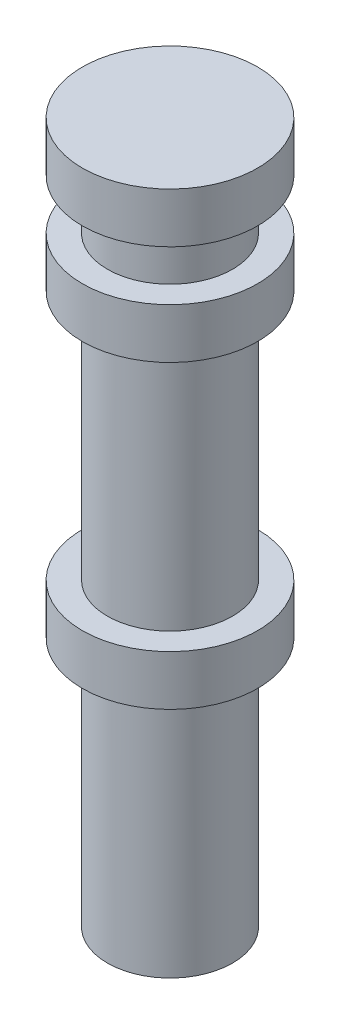
ISO-10303-21;
HEADER;
FILE_DESCRIPTION(('STEP AP214'),'2;1');
FILE_NAME('part.step','',(''),(''),'','','');
FILE_SCHEMA(('AUTOMOTIVE_DESIGN { 1 0 10303 214 1 1 1 1 }'));
ENDSEC;
DATA;
#1=APPLICATION_CONTEXT('core data for automotive mechanical design processes');
#2=APPLICATION_PROTOCOL_DEFINITION('international standard','automotive_design',2000,#1);
#3=PRODUCT_CONTEXT('',#1,'mechanical');
#4=PRODUCT('Part','Part','',(#3));
#5=PRODUCT_RELATED_PRODUCT_CATEGORY('part','',(#4));
#6=PRODUCT_DEFINITION_FORMATION('','',#4);
#7=PRODUCT_DEFINITION_CONTEXT('part definition',#1,'design');
#8=PRODUCT_DEFINITION('design','',#6,#7);
#9=PRODUCT_DEFINITION_SHAPE('','',#8);
#10=(LENGTH_UNIT() NAMED_UNIT(*) SI_UNIT(.MILLI.,.METRE.));
#11=(NAMED_UNIT(*) PLANE_ANGLE_UNIT() SI_UNIT($,.RADIAN.));
#12=(NAMED_UNIT(*) SI_UNIT($,.STERADIAN.) SOLID_ANGLE_UNIT());
#13=UNCERTAINTY_MEASURE_WITH_UNIT(LENGTH_MEASURE(1.E-05),#10,'distance_accuracy_value','');
#14=(GEOMETRIC_REPRESENTATION_CONTEXT(3) GLOBAL_UNCERTAINTY_ASSIGNED_CONTEXT((#13)) GLOBAL_UNIT_ASSIGNED_CONTEXT((#10,
#11,#12)) REPRESENTATION_CONTEXT('',''));
#15=CARTESIAN_POINT('',(0.,0.,0.));
#16=DIRECTION('',(0.,0.,1.));
#17=DIRECTION('',(1.,0.,0.));
#18=AXIS2_PLACEMENT_3D('',#15,#16,#17);
#19=CARTESIAN_POINT('',(0.,28.,0.));
#20=DIRECTION('',(0.,-1.,0.));
#21=DIRECTION('',(0.,0.,-1.));
#22=AXIS2_PLACEMENT_3D('',#19,#20,#21);
#23=CYLINDRICAL_SURFACE('',#22,2.5);
#24=CARTESIAN_POINT('',(0.,22.,0.));
#25=DIRECTION('',(0.,1.,0.));
#26=DIRECTION('',(0.,0.,1.));
#27=AXIS2_PLACEMENT_3D('',#24,#25,#26);
#28=CIRCLE('',#27,2.5);
#29=CARTESIAN_POINT('',(0.,22.,2.5));
#30=VERTEX_POINT('',#29);
#31=EDGE_CURVE('E63',#30,#30,#28,.T.);
#32=ORIENTED_EDGE('',*,*,#31,.F.);
#33=EDGE_LOOP('',(#32));
#34=FACE_BOUND('',#33,.T.);
#35=CARTESIAN_POINT('',(0.,12.,0.));
#36=DIRECTION('',(0.,-1.,0.));
#37=DIRECTION('',(0.,0.,-1.));
#38=AXIS2_PLACEMENT_3D('',#35,#36,#37);
#39=CIRCLE('',#38,2.5);
#40=CARTESIAN_POINT('',(0.,12.,-2.5));
#41=VERTEX_POINT('',#40);
#42=EDGE_CURVE('E11',#41,#41,#39,.T.);
#43=ORIENTED_EDGE('',*,*,#42,.F.);
#44=EDGE_LOOP('',(#43));
#45=FACE_BOUND('',#44,.T.);
#46=ADVANCED_FACE('F55',(#34,#45),#23,.T.);
#47=CARTESIAN_POINT('',(0.,24.,0.));
#48=DIRECTION('',(0.,1.,0.));
#49=DIRECTION('',(0.,0.,1.));
#50=AXIS2_PLACEMENT_3D('',#47,#48,#49);
#51=CIRCLE('',#50,2.5);
#52=CARTESIAN_POINT('',(0.,24.,2.5));
#53=VERTEX_POINT('',#52);
#54=EDGE_CURVE('E77',#53,#53,#51,.T.);
#55=ORIENTED_EDGE('',*,*,#54,.T.);
#56=EDGE_LOOP('',(#55));
#57=FACE_BOUND('',#56,.T.);
#58=CARTESIAN_POINT('',(0.,26.,0.));
#59=DIRECTION('',(0.,1.,0.));
#60=DIRECTION('',(0.,0.,1.));
#61=AXIS2_PLACEMENT_3D('',#58,#59,#60);
#62=CIRCLE('',#61,2.5);
#63=CARTESIAN_POINT('',(0.,26.,2.5));
#64=VERTEX_POINT('',#63);
#65=EDGE_CURVE('E68',#64,#64,#62,.T.);
#66=ORIENTED_EDGE('',*,*,#65,.F.);
#67=EDGE_LOOP('',(#66));
#68=FACE_BOUND('',#67,.T.);
#69=ADVANCED_FACE('F57',(#57,#68),#23,.T.);
#70=CARTESIAN_POINT('',(0.,26.,0.));
#71=DIRECTION('',(0.,1.,0.));
#72=DIRECTION('',(0.,0.,1.));
#73=AXIS2_PLACEMENT_3D('',#70,#71,#72);
#74=CYLINDRICAL_SURFACE('',#73,3.5);
#75=CARTESIAN_POINT('',(0.,26.,0.));
#76=DIRECTION('',(0.,1.,0.));
#77=DIRECTION('',(0.,0.,1.));
#78=AXIS2_PLACEMENT_3D('',#75,#76,#77);
#79=CIRCLE('',#78,3.5);
#80=CARTESIAN_POINT('',(0.,26.,3.5));
#81=VERTEX_POINT('',#80);
#82=EDGE_CURVE('E102',#81,#81,#79,.T.);
#83=ORIENTED_EDGE('',*,*,#82,.T.);
#84=EDGE_LOOP('',(#83));
#85=FACE_BOUND('',#84,.T.);
#86=CARTESIAN_POINT('',(0.,28.,0.));
#87=DIRECTION('',(0.,1.,0.));
#88=DIRECTION('',(0.,0.,1.));
#89=AXIS2_PLACEMENT_3D('',#86,#87,#88);
#90=CIRCLE('',#89,3.5);
#91=CARTESIAN_POINT('',(0.,28.,3.5));
#92=VERTEX_POINT('',#91);
#93=EDGE_CURVE('E106',#92,#92,#90,.T.);
#94=ORIENTED_EDGE('',*,*,#93,.F.);
#95=EDGE_LOOP('',(#94));
#96=FACE_BOUND('',#95,.T.);
#97=ADVANCED_FACE('F137',(#85,#96),#74,.T.);
#98=CARTESIAN_POINT('',(0.,26.,0.));
#99=DIRECTION('',(0.,1.,0.));
#100=DIRECTION('',(0.,0.,1.));
#101=AXIS2_PLACEMENT_3D('',#98,#99,#100);
#102=PLANE('',#101);
#103=ORIENTED_EDGE('',*,*,#65,.T.);
#104=EDGE_LOOP('',(#103));
#105=FACE_BOUND('',#104,.T.);
#106=ORIENTED_EDGE('',*,*,#82,.F.);
#107=EDGE_LOOP('',(#106));
#108=FACE_BOUND('',#107,.T.);
#109=ADVANCED_FACE('F143',(#105,#108),#102,.F.);
#110=CARTESIAN_POINT('',(0.,28.,0.));
#111=DIRECTION('',(0.,1.,0.));
#112=DIRECTION('',(0.,0.,1.));
#113=AXIS2_PLACEMENT_3D('',#110,#111,#112);
#114=PLANE('',#113);
#115=ORIENTED_EDGE('',*,*,#93,.T.);
#116=EDGE_LOOP('',(#115));
#117=FACE_BOUND('',#116,.T.);
#118=ADVANCED_FACE('F153',(#117),#114,.T.);
#119=CARTESIAN_POINT('',(0.,22.,0.));
#120=DIRECTION('',(0.,1.,0.));
#121=DIRECTION('',(0.,0.,1.));
#122=AXIS2_PLACEMENT_3D('',#119,#120,#121);
#123=PLANE('',#122);
#124=ORIENTED_EDGE('',*,*,#31,.T.);
#125=EDGE_LOOP('',(#124));
#126=FACE_BOUND('',#125,.T.);
#127=CARTESIAN_POINT('',(0.,22.,0.));
#128=DIRECTION('',(0.,1.,0.));
#129=DIRECTION('',(0.,0.,1.));
#130=AXIS2_PLACEMENT_3D('',#127,#128,#129);
#131=CIRCLE('',#130,3.5);
#132=CARTESIAN_POINT('',(0.,22.,3.5));
#133=VERTEX_POINT('',#132);
#134=EDGE_CURVE('E81',#133,#133,#131,.T.);
#135=ORIENTED_EDGE('',*,*,#134,.F.);
#136=EDGE_LOOP('',(#135));
#137=FACE_BOUND('',#136,.T.);
#138=ADVANCED_FACE('F127',(#126,#137),#123,.F.);
#139=CARTESIAN_POINT('',(0.,24.,0.));
#140=DIRECTION('',(0.,1.,0.));
#141=DIRECTION('',(0.,0.,1.));
#142=AXIS2_PLACEMENT_3D('',#139,#140,#141);
#143=PLANE('',#142);
#144=ORIENTED_EDGE('',*,*,#54,.F.);
#145=EDGE_LOOP('',(#144));
#146=FACE_BOUND('',#145,.T.);
#147=CARTESIAN_POINT('',(0.,24.,0.));
#148=DIRECTION('',(0.,1.,0.));
#149=DIRECTION('',(0.,0.,1.));
#150=AXIS2_PLACEMENT_3D('',#147,#148,#149);
#151=CIRCLE('',#150,3.5);
#152=CARTESIAN_POINT('',(0.,24.,3.5));
#153=VERTEX_POINT('',#152);
#154=EDGE_CURVE('E88',#153,#153,#151,.T.);
#155=ORIENTED_EDGE('',*,*,#154,.T.);
#156=EDGE_LOOP('',(#155));
#157=FACE_BOUND('',#156,.T.);
#158=ADVANCED_FACE('F163',(#146,#157),#143,.T.);
#159=CARTESIAN_POINT('',(0.,22.,0.));
#160=DIRECTION('',(0.,1.,0.));
#161=DIRECTION('',(0.,0.,1.));
#162=AXIS2_PLACEMENT_3D('',#159,#160,#161);
#163=CYLINDRICAL_SURFACE('',#162,3.5);
#164=CARTESIAN_POINT('',(0.,22.,3.5));
#165=CARTESIAN_POINT('',(0.,22.0208333333333,3.5));
#166=CARTESIAN_POINT('',(0.,22.0416666666667,3.5));
#167=CARTESIAN_POINT('',(0.,22.0833333333333,3.5));
#168=CARTESIAN_POINT('',(0.,22.1041666666667,3.5));
#169=CARTESIAN_POINT('',(0.,22.1458333333333,3.5));
#170=CARTESIAN_POINT('',(0.,22.1666666666667,3.5));
#171=CARTESIAN_POINT('',(0.,22.2083333333333,3.5));
#172=CARTESIAN_POINT('',(0.,22.2291666666667,3.5));
#173=CARTESIAN_POINT('',(0.,22.2708333333333,3.5));
#174=CARTESIAN_POINT('',(0.,22.2916666666667,3.5));
#175=CARTESIAN_POINT('',(0.,22.3333333333333,3.5));
#176=CARTESIAN_POINT('',(0.,22.3541666666667,3.5));
#177=CARTESIAN_POINT('',(0.,22.3958333333333,3.5));
#178=CARTESIAN_POINT('',(0.,22.4166666666667,3.5));
#179=CARTESIAN_POINT('',(0.,22.4583333333333,3.5));
#180=CARTESIAN_POINT('',(0.,22.4791666666667,3.5));
#181=CARTESIAN_POINT('',(0.,22.5208333333333,3.5));
#182=CARTESIAN_POINT('',(0.,22.5416666666667,3.5));
#183=CARTESIAN_POINT('',(0.,22.5833333333333,3.5));
#184=CARTESIAN_POINT('',(0.,22.6041666666667,3.5));
#185=CARTESIAN_POINT('',(0.,22.6458333333333,3.5));
#186=CARTESIAN_POINT('',(0.,22.6666666666667,3.5));
#187=CARTESIAN_POINT('',(0.,22.7083333333333,3.5));
#188=CARTESIAN_POINT('',(0.,22.7291666666667,3.5));
#189=CARTESIAN_POINT('',(0.,22.7708333333333,3.5));
#190=CARTESIAN_POINT('',(0.,22.7916666666667,3.5));
#191=CARTESIAN_POINT('',(0.,22.8333333333333,3.5));
#192=CARTESIAN_POINT('',(0.,22.8541666666667,3.5));
#193=CARTESIAN_POINT('',(0.,22.8958333333333,3.5));
#194=CARTESIAN_POINT('',(0.,22.9166666666667,3.5));
#195=CARTESIAN_POINT('',(0.,22.9583333333333,3.5));
#196=CARTESIAN_POINT('',(0.,22.9791666666667,3.5));
#197=CARTESIAN_POINT('',(0.,23.0208333333333,3.5));
#198=CARTESIAN_POINT('',(0.,23.0416666666667,3.5));
#199=CARTESIAN_POINT('',(0.,23.0833333333333,3.5));
#200=CARTESIAN_POINT('',(0.,23.1041666666667,3.5));
#201=CARTESIAN_POINT('',(0.,23.1458333333333,3.5));
#202=CARTESIAN_POINT('',(0.,23.1666666666667,3.5));
#203=CARTESIAN_POINT('',(0.,23.2083333333333,3.5));
#204=CARTESIAN_POINT('',(0.,23.2291666666667,3.5));
#205=CARTESIAN_POINT('',(0.,23.2708333333333,3.5));
#206=CARTESIAN_POINT('',(0.,23.2916666666667,3.5));
#207=CARTESIAN_POINT('',(0.,23.3333333333333,3.5));
#208=CARTESIAN_POINT('',(0.,23.3541666666667,3.5));
#209=CARTESIAN_POINT('',(0.,23.3958333333333,3.5));
#210=CARTESIAN_POINT('',(0.,23.4166666666667,3.5));
#211=CARTESIAN_POINT('',(0.,23.4583333333333,3.5));
#212=CARTESIAN_POINT('',(0.,23.4791666666667,3.5));
#213=CARTESIAN_POINT('',(0.,23.5208333333333,3.5));
#214=CARTESIAN_POINT('',(0.,23.5416666666667,3.5));
#215=CARTESIAN_POINT('',(0.,23.5833333333333,3.5));
#216=CARTESIAN_POINT('',(0.,23.6041666666667,3.5));
#217=CARTESIAN_POINT('',(0.,23.6458333333333,3.5));
#218=CARTESIAN_POINT('',(0.,23.6666666666667,3.5));
#219=CARTESIAN_POINT('',(0.,23.7083333333333,3.5));
#220=CARTESIAN_POINT('',(0.,23.7291666666667,3.5));
#221=CARTESIAN_POINT('',(0.,23.7708333333333,3.5));
#222=CARTESIAN_POINT('',(0.,23.7916666666667,3.5));
#223=CARTESIAN_POINT('',(0.,23.8333333333333,3.5));
#224=CARTESIAN_POINT('',(0.,23.8541666666667,3.5));
#225=CARTESIAN_POINT('',(0.,23.8958333333333,3.5));
#226=CARTESIAN_POINT('',(0.,23.9166666666667,3.5));
#227=CARTESIAN_POINT('',(0.,23.9583333333333,3.5));
#228=CARTESIAN_POINT('',(0.,23.9791666666667,3.5));
#229=CARTESIAN_POINT('',(0.,24.,3.5));
#230=B_SPLINE_CURVE_WITH_KNOTS('',3,(#164,#165,#166,#167,#168,#169,#170,#171,#172,#173,#174,
#175,#176,#177,#178,#179,#180,#181,#182,#183,#184,#185,#186,#187,#188,#189,#190,#191,#192,#193,
#194,#195,#196,#197,#198,#199,#200,#201,#202,#203,#204,#205,#206,#207,#208,#209,#210,#211,#212,
#213,#214,#215,#216,#217,#218,#219,#220,#221,#222,#223,#224,#225,#226,#227,#228,#229),
.UNSPECIFIED.,.F.,.F.,(4,2,2,2,2,2,2,2,2,2,2,2,2,2,2,2,2,2,2,2,2,2,2,2,2,2,2,2,2,2,2,2,4),(0.,
0.0625000000000035,0.125000000000004,0.187500000000004,0.250000000000004,0.312500000000004,
0.375000000000004,0.437500000000004,0.500000000000004,0.562500000000004,0.625000000000004,
0.687500000000004,0.750000000000004,0.812500000000004,0.875000000000004,0.937500000000004,1.,
1.0625,1.125,1.1875,1.25,1.3125,1.375,1.4375,1.5,1.5625,1.625,1.6875,1.75000000000001,
1.81250000000001,1.87500000000001,1.93750000000001,2.00000000000001),.UNSPECIFIED.);
#231=EDGE_CURVE('BSEAM130',#133,#153,#230,.T.);
#232=ORIENTED_EDGE('',*,*,#134,.T.);
#233=ORIENTED_EDGE('',*,*,#154,.F.);
#234=ORIENTED_EDGE('',*,*,#231,.T.);
#235=ORIENTED_EDGE('',*,*,#231,.F.);
#236=EDGE_LOOP('',(#232,#234,#233,#235));
#237=FACE_BOUND('',#236,.T.);
#238=ADVANCED_FACE('F130',(#237),#163,.T.);
#239=CARTESIAN_POINT('',(0.,12.,0.));
#240=DIRECTION('',(0.,-1.,0.));
#241=DIRECTION('',(0.,0.,-1.));
#242=AXIS2_PLACEMENT_3D('',#239,#240,#241);
#243=PLANE('',#242);
#244=ORIENTED_EDGE('',*,*,#42,.T.);
#245=EDGE_LOOP('',(#244));
#246=FACE_BOUND('',#245,.T.);
#247=CARTESIAN_POINT('',(0.,12.,0.));
#248=DIRECTION('',(0.,-1.,0.));
#249=DIRECTION('',(0.,0.,-1.));
#250=AXIS2_PLACEMENT_3D('',#247,#248,#249);
#251=CIRCLE('',#250,3.5);
#252=CARTESIAN_POINT('',(0.,12.,-3.5));
#253=VERTEX_POINT('',#252);
#254=EDGE_CURVE('E91',#253,#253,#251,.T.);
#255=ORIENTED_EDGE('',*,*,#254,.F.);
#256=EDGE_LOOP('',(#255));
#257=FACE_BOUND('',#256,.T.);
#258=ADVANCED_FACE('F119',(#246,#257),#243,.F.);
#259=CARTESIAN_POINT('',(0.,10.,0.));
#260=DIRECTION('',(0.,-1.,0.));
#261=DIRECTION('',(0.,0.,-1.));
#262=AXIS2_PLACEMENT_3D('',#259,#260,#261);
#263=PLANE('',#262);
#264=CARTESIAN_POINT('',(0.,10.,0.));
#265=DIRECTION('',(0.,-1.,0.));
#266=DIRECTION('',(0.,0.,-1.));
#267=AXIS2_PLACEMENT_3D('',#264,#265,#266);
#268=CIRCLE('',#267,2.5);
#269=CARTESIAN_POINT('',(0.,10.,-2.5));
#270=VERTEX_POINT('',#269);
#271=EDGE_CURVE('E78',#270,#270,#268,.T.);
#272=ORIENTED_EDGE('',*,*,#271,.F.);
#273=EDGE_LOOP('',(#272));
#274=FACE_BOUND('',#273,.T.);
#275=CARTESIAN_POINT('',(0.,10.,0.));
#276=DIRECTION('',(0.,-1.,0.));
#277=DIRECTION('',(0.,0.,-1.));
#278=AXIS2_PLACEMENT_3D('',#275,#276,#277);
#279=CIRCLE('',#278,3.5);
#280=CARTESIAN_POINT('',(0.,10.,-3.5));
#281=VERTEX_POINT('',#280);
#282=EDGE_CURVE('E82',#281,#281,#279,.T.);
#283=ORIENTED_EDGE('',*,*,#282,.T.);
#284=EDGE_LOOP('',(#283));
#285=FACE_BOUND('',#284,.T.);
#286=ADVANCED_FACE('F124',(#274,#285),#263,.T.);
#287=CARTESIAN_POINT('',(0.,12.,0.));
#288=DIRECTION('',(0.,-1.,0.));
#289=DIRECTION('',(0.,0.,-1.));
#290=AXIS2_PLACEMENT_3D('',#287,#288,#289);
#291=CYLINDRICAL_SURFACE('',#290,3.5);
#292=CARTESIAN_POINT('',(0.,12.,-3.5));
#293=CARTESIAN_POINT('',(0.,11.9791666666667,-3.5));
#294=CARTESIAN_POINT('',(0.,11.9583333333333,-3.5));
#295=CARTESIAN_POINT('',(0.,11.9166666666667,-3.5));
#296=CARTESIAN_POINT('',(0.,11.8958333333333,-3.5));
#297=CARTESIAN_POINT('',(0.,11.8541666666667,-3.5));
#298=CARTESIAN_POINT('',(0.,11.8333333333333,-3.5));
#299=CARTESIAN_POINT('',(0.,11.7916666666667,-3.5));
#300=CARTESIAN_POINT('',(0.,11.7708333333333,-3.5));
#301=CARTESIAN_POINT('',(0.,11.7291666666667,-3.5));
#302=CARTESIAN_POINT('',(0.,11.7083333333333,-3.5));
#303=CARTESIAN_POINT('',(0.,11.6666666666667,-3.5));
#304=CARTESIAN_POINT('',(0.,11.6458333333333,-3.5));
#305=CARTESIAN_POINT('',(0.,11.6041666666667,-3.5));
#306=CARTESIAN_POINT('',(0.,11.5833333333333,-3.5));
#307=CARTESIAN_POINT('',(0.,11.5416666666667,-3.5));
#308=CARTESIAN_POINT('',(0.,11.5208333333333,-3.5));
#309=CARTESIAN_POINT('',(0.,11.4791666666667,-3.5));
#310=CARTESIAN_POINT('',(0.,11.4583333333333,-3.5));
#311=CARTESIAN_POINT('',(0.,11.4166666666667,-3.5));
#312=CARTESIAN_POINT('',(0.,11.3958333333333,-3.5));
#313=CARTESIAN_POINT('',(0.,11.3541666666667,-3.5));
#314=CARTESIAN_POINT('',(0.,11.3333333333333,-3.5));
#315=CARTESIAN_POINT('',(0.,11.2916666666667,-3.5));
#316=CARTESIAN_POINT('',(0.,11.2708333333333,-3.5));
#317=CARTESIAN_POINT('',(0.,11.2291666666667,-3.5));
#318=CARTESIAN_POINT('',(0.,11.2083333333333,-3.5));
#319=CARTESIAN_POINT('',(0.,11.1666666666667,-3.5));
#320=CARTESIAN_POINT('',(0.,11.1458333333333,-3.5));
#321=CARTESIAN_POINT('',(0.,11.1041666666667,-3.5));
#322=CARTESIAN_POINT('',(0.,11.0833333333333,-3.5));
#323=CARTESIAN_POINT('',(0.,11.0416666666667,-3.5));
#324=CARTESIAN_POINT('',(0.,11.0208333333333,-3.5));
#325=CARTESIAN_POINT('',(0.,10.9791666666667,-3.5));
#326=CARTESIAN_POINT('',(0.,10.9583333333333,-3.5));
#327=CARTESIAN_POINT('',(0.,10.9166666666667,-3.5));
#328=CARTESIAN_POINT('',(0.,10.8958333333333,-3.5));
#329=CARTESIAN_POINT('',(0.,10.8541666666667,-3.5));
#330=CARTESIAN_POINT('',(0.,10.8333333333333,-3.5));
#331=CARTESIAN_POINT('',(0.,10.7916666666667,-3.5));
#332=CARTESIAN_POINT('',(0.,10.7708333333333,-3.5));
#333=CARTESIAN_POINT('',(0.,10.7291666666667,-3.5));
#334=CARTESIAN_POINT('',(0.,10.7083333333333,-3.5));
#335=CARTESIAN_POINT('',(0.,10.6666666666667,-3.5));
#336=CARTESIAN_POINT('',(0.,10.6458333333333,-3.5));
#337=CARTESIAN_POINT('',(0.,10.6041666666667,-3.5));
#338=CARTESIAN_POINT('',(0.,10.5833333333333,-3.5));
#339=CARTESIAN_POINT('',(0.,10.5416666666667,-3.5));
#340=CARTESIAN_POINT('',(0.,10.5208333333333,-3.5));
#341=CARTESIAN_POINT('',(0.,10.4791666666667,-3.5));
#342=CARTESIAN_POINT('',(0.,10.4583333333333,-3.5));
#343=CARTESIAN_POINT('',(0.,10.4166666666667,-3.5));
#344=CARTESIAN_POINT('',(0.,10.3958333333333,-3.5));
#345=CARTESIAN_POINT('',(0.,10.3541666666667,-3.5));
#346=CARTESIAN_POINT('',(0.,10.3333333333333,-3.5));
#347=CARTESIAN_POINT('',(0.,10.2916666666667,-3.5));
#348=CARTESIAN_POINT('',(0.,10.2708333333333,-3.5));
#349=CARTESIAN_POINT('',(0.,10.2291666666667,-3.5));
#350=CARTESIAN_POINT('',(0.,10.2083333333333,-3.5));
#351=CARTESIAN_POINT('',(0.,10.1666666666667,-3.5));
#352=CARTESIAN_POINT('',(0.,10.1458333333333,-3.5));
#353=CARTESIAN_POINT('',(0.,10.1041666666667,-3.5));
#354=CARTESIAN_POINT('',(0.,10.0833333333333,-3.5));
#355=CARTESIAN_POINT('',(0.,10.0416666666667,-3.5));
#356=CARTESIAN_POINT('',(0.,10.0208333333333,-3.5));
#357=CARTESIAN_POINT('',(0.,10.,-3.5));
#358=B_SPLINE_CURVE_WITH_KNOTS('',3,(#292,#293,#294,#295,#296,#297,#298,#299,#300,#301,#302,
#303,#304,#305,#306,#307,#308,#309,#310,#311,#312,#313,#314,#315,#316,#317,#318,#319,#320,#321,
#322,#323,#324,#325,#326,#327,#328,#329,#330,#331,#332,#333,#334,#335,#336,#337,#338,#339,#340,
#341,#342,#343,#344,#345,#346,#347,#348,#349,#350,#351,#352,#353,#354,#355,#356,#357),
.UNSPECIFIED.,.F.,.F.,(4,2,2,2,2,2,2,2,2,2,2,2,2,2,2,2,2,2,2,2,2,2,2,2,2,2,2,2,2,2,2,2,4),(0.,
0.0624999999999983,0.124999999999998,0.187499999999998,0.249999999999999,0.312499999999999,
0.374999999999999,0.437499999999999,0.499999999999999,0.562499999999999,0.624999999999999,
0.687499999999999,0.749999999999999,0.812499999999999,0.874999999999999,0.937499999999999,
0.999999999999999,1.0625,1.125,1.1875,1.25,1.3125,1.375,1.4375,1.5,1.5625,1.625,1.6875,1.75,
1.8125,1.875,1.9375,2.),.UNSPECIFIED.);
#359=EDGE_CURVE('BSEAM118',#253,#281,#358,.T.);
#360=ORIENTED_EDGE('',*,*,#254,.T.);
#361=ORIENTED_EDGE('',*,*,#282,.F.);
#362=ORIENTED_EDGE('',*,*,#359,.T.);
#363=ORIENTED_EDGE('',*,*,#359,.F.);
#364=EDGE_LOOP('',(#360,#362,#361,#363));
#365=FACE_BOUND('',#364,.T.);
#366=ADVANCED_FACE('F118',(#365),#291,.T.);
#367=CARTESIAN_POINT('',(0.,0.,0.));
#368=DIRECTION('',(0.,1.,0.));
#369=DIRECTION('',(0.,0.,1.));
#370=AXIS2_PLACEMENT_3D('',#367,#368,#369);
#371=PLANE('',#370);
#372=CARTESIAN_POINT('',(0.,0.,0.));
#373=DIRECTION('',(0.,1.,0.));
#374=DIRECTION('',(0.,0.,1.));
#375=AXIS2_PLACEMENT_3D('',#372,#373,#374);
#376=CIRCLE('',#375,2.5);
#377=CARTESIAN_POINT('',(0.,0.,2.5));
#378=VERTEX_POINT('',#377);
#379=EDGE_CURVE('E74',#378,#378,#376,.T.);
#380=ORIENTED_EDGE('',*,*,#379,.F.);
#381=EDGE_LOOP('',(#380));
#382=FACE_BOUND('',#381,.T.);
#383=ADVANCED_FACE('F116',(#382),#371,.F.);
#384=ORIENTED_EDGE('',*,*,#271,.T.);
#385=EDGE_LOOP('',(#384));
#386=FACE_BOUND('',#385,.T.);
#387=ORIENTED_EDGE('',*,*,#379,.T.);
#388=EDGE_LOOP('',(#387));
#389=FACE_BOUND('',#388,.T.);
#390=ADVANCED_FACE('F114',(#386,#389),#23,.T.);
#391=CLOSED_SHELL('',(#46,#69,#97,#109,#118,#138,#158,#238,#258,#286,#366,#383,#390));
#392=MANIFOLD_SOLID_BREP('B2',#391);
#393=ADVANCED_BREP_SHAPE_REPRESENTATION('',(#18,#392),#14);
#394=SHAPE_DEFINITION_REPRESENTATION(#9,#393);
ENDSEC;
END-ISO-10303-21;
